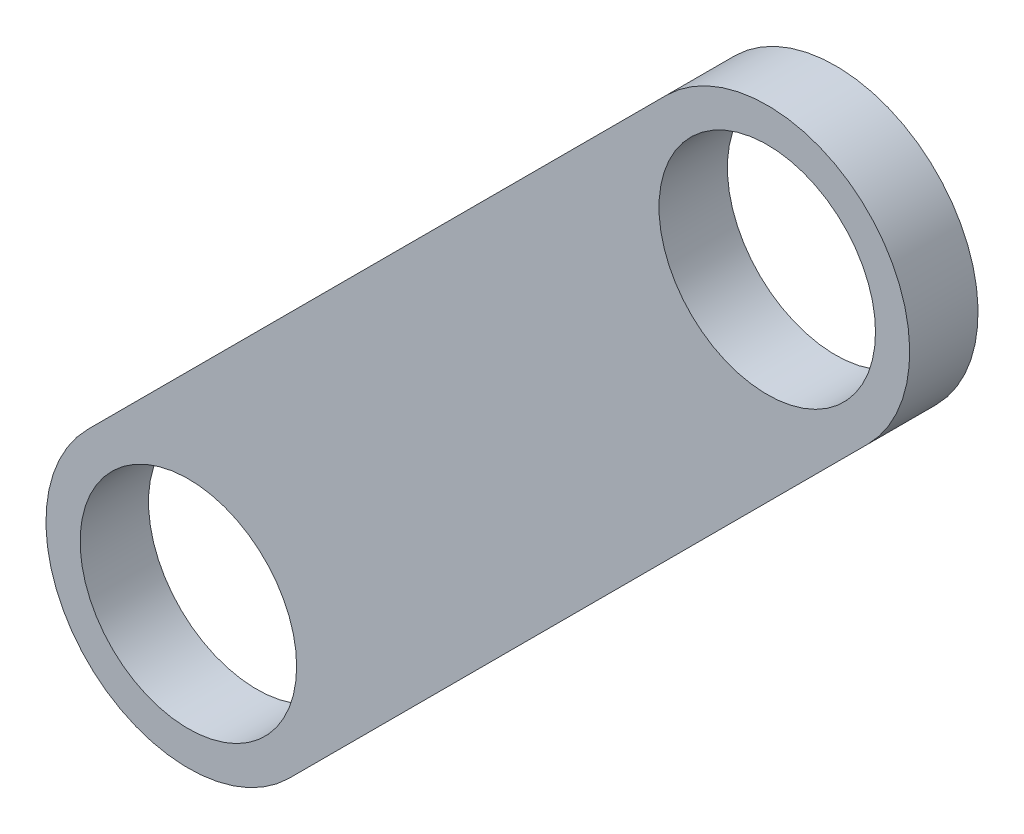
ISO-10303-21;
HEADER;
FILE_DESCRIPTION(('STEP AP214'),'2;1');
FILE_NAME('part.step','',(''),(''),'','','');
FILE_SCHEMA(('AUTOMOTIVE_DESIGN { 1 0 10303 214 1 1 1 1 }'));
ENDSEC;
DATA;
#1=APPLICATION_CONTEXT('core data for automotive mechanical design processes');
#2=APPLICATION_PROTOCOL_DEFINITION('international standard','automotive_design',2000,#1);
#3=PRODUCT_CONTEXT('',#1,'mechanical');
#4=PRODUCT('Part','Part','',(#3));
#5=PRODUCT_RELATED_PRODUCT_CATEGORY('part','',(#4));
#6=PRODUCT_DEFINITION_FORMATION('','',#4);
#7=PRODUCT_DEFINITION_CONTEXT('part definition',#1,'design');
#8=PRODUCT_DEFINITION('design','',#6,#7);
#9=PRODUCT_DEFINITION_SHAPE('','',#8);
#10=(LENGTH_UNIT() NAMED_UNIT(*) SI_UNIT(.MILLI.,.METRE.));
#11=(NAMED_UNIT(*) PLANE_ANGLE_UNIT() SI_UNIT($,.RADIAN.));
#12=(NAMED_UNIT(*) SI_UNIT($,.STERADIAN.) SOLID_ANGLE_UNIT());
#13=UNCERTAINTY_MEASURE_WITH_UNIT(LENGTH_MEASURE(1.E-05),#10,'distance_accuracy_value','');
#14=(GEOMETRIC_REPRESENTATION_CONTEXT(3) GLOBAL_UNCERTAINTY_ASSIGNED_CONTEXT((#13)) GLOBAL_UNIT_ASSIGNED_CONTEXT((#10,
#11,#12)) REPRESENTATION_CONTEXT('',''));
#15=CARTESIAN_POINT('',(0.,0.,0.));
#16=DIRECTION('',(0.,0.,1.));
#17=DIRECTION('',(1.,0.,0.));
#18=AXIS2_PLACEMENT_3D('',#15,#16,#17);
#19=CARTESIAN_POINT('',(0.,0.,6.));
#20=DIRECTION('',(0.,0.,1.));
#21=DIRECTION('',(1.,0.,0.));
#22=AXIS2_PLACEMENT_3D('',#19,#20,#21);
#23=PLANE('',#22);
#24=CARTESIAN_POINT('',(0.,0.,6.));
#25=DIRECTION('',(0.,0.,1.));
#26=DIRECTION('',(1.,0.,0.));
#27=AXIS2_PLACEMENT_3D('',#24,#25,#26);
#28=CIRCLE('',#27,9.5);
#29=CARTESIAN_POINT('',(9.5,0.,6.));
#30=VERTEX_POINT('',#29);
#31=EDGE_CURVE('E103',#30,#30,#28,.T.);
#32=ORIENTED_EDGE('',*,*,#31,.F.);
#33=EDGE_LOOP('',(#32));
#34=FACE_BOUND('',#33,.T.);
#35=CARTESIAN_POINT('',(0.,0.,6.));
#36=DIRECTION('',(0.,0.,1.));
#37=DIRECTION('',(1.,0.,0.));
#38=AXIS2_PLACEMENT_3D('',#35,#36,#37);
#39=CIRCLE('',#38,12.5);
#40=CARTESIAN_POINT('',(-8.83883476483184,8.83883476483184,6.));
#41=VERTEX_POINT('',#40);
#42=CARTESIAN_POINT('',(8.83883476483184,-8.83883476483184,6.));
#43=VERTEX_POINT('',#42);
#44=EDGE_CURVE('E88',#41,#43,#39,.T.);
#45=ORIENTED_EDGE('',*,*,#44,.T.);
#46=DIRECTION('',(0.707106781186548,0.707106781186547,0.));
#47=VECTOR('',#46,1.);
#48=CARTESIAN_POINT('',(8.83883476483184,-8.83883476483184,6.));
#49=LINE('',#48,#47);
#50=CARTESIAN_POINT('',(59.6388347648318,41.9611652351682,6.));
#51=VERTEX_POINT('',#50);
#52=EDGE_CURVE('E83',#43,#51,#49,.T.);
#53=ORIENTED_EDGE('',*,*,#52,.T.);
#54=CARTESIAN_POINT('',(50.8,50.8,6.));
#55=DIRECTION('',(0.,0.,1.));
#56=DIRECTION('',(1.,0.,0.));
#57=AXIS2_PLACEMENT_3D('',#54,#55,#56);
#58=CIRCLE('',#57,12.5);
#59=CARTESIAN_POINT('',(41.9611652351682,59.6388347648318,6.));
#60=VERTEX_POINT('',#59);
#61=EDGE_CURVE('E86',#51,#60,#58,.T.);
#62=ORIENTED_EDGE('',*,*,#61,.T.);
#63=DIRECTION('',(-0.707106781186547,-0.707106781186547,0.));
#64=VECTOR('',#63,1.);
#65=CARTESIAN_POINT('',(-8.83883476483184,8.83883476483184,6.));
#66=LINE('',#65,#64);
#67=EDGE_CURVE('E53',#60,#41,#66,.T.);
#68=ORIENTED_EDGE('',*,*,#67,.T.);
#69=EDGE_LOOP('',(#45,#53,#62,#68));
#70=FACE_BOUND('',#69,.T.);
#71=CARTESIAN_POINT('',(50.8,50.8,6.));
#72=DIRECTION('',(0.,0.,1.));
#73=DIRECTION('',(1.,0.,0.));
#74=AXIS2_PLACEMENT_3D('',#71,#72,#73);
#75=CIRCLE('',#74,9.5);
#76=CARTESIAN_POINT('',(60.3,50.8,6.));
#77=VERTEX_POINT('',#76);
#78=EDGE_CURVE('E118',#77,#77,#75,.T.);
#79=ORIENTED_EDGE('',*,*,#78,.F.);
#80=EDGE_LOOP('',(#79));
#81=FACE_BOUND('',#80,.T.);
#82=ADVANCED_FACE('F36',(#34,#70,#81),#23,.T.);
#83=CARTESIAN_POINT('',(0.,0.,0.));
#84=DIRECTION('',(0.,0.,1.));
#85=DIRECTION('',(1.,0.,0.));
#86=AXIS2_PLACEMENT_3D('',#83,#84,#85);
#87=PLANE('',#86);
#88=CARTESIAN_POINT('',(0.,0.,0.));
#89=DIRECTION('',(0.,0.,1.));
#90=DIRECTION('',(1.,0.,0.));
#91=AXIS2_PLACEMENT_3D('',#88,#89,#90);
#92=CIRCLE('',#91,12.5);
#93=CARTESIAN_POINT('',(-8.83883476483184,8.83883476483184,0.));
#94=VERTEX_POINT('',#93);
#95=CARTESIAN_POINT('',(8.83883476483184,-8.83883476483184,0.));
#96=VERTEX_POINT('',#95);
#97=EDGE_CURVE('E100',#94,#96,#92,.T.);
#98=ORIENTED_EDGE('',*,*,#97,.F.);
#99=DIRECTION('',(-0.707106781186547,-0.707106781186547,0.));
#100=VECTOR('',#99,1.);
#101=CARTESIAN_POINT('',(-8.83883476483184,8.83883476483184,0.));
#102=LINE('',#101,#100);
#103=CARTESIAN_POINT('',(41.9611652351682,59.6388347648318,0.));
#104=VERTEX_POINT('',#103);
#105=EDGE_CURVE('E76',#104,#94,#102,.T.);
#106=ORIENTED_EDGE('',*,*,#105,.F.);
#107=CARTESIAN_POINT('',(50.8,50.8,0.));
#108=DIRECTION('',(0.,0.,1.));
#109=DIRECTION('',(1.,0.,0.));
#110=AXIS2_PLACEMENT_3D('',#107,#108,#109);
#111=CIRCLE('',#110,12.5);
#112=CARTESIAN_POINT('',(59.6388347648318,41.9611652351682,0.));
#113=VERTEX_POINT('',#112);
#114=EDGE_CURVE('E70',#113,#104,#111,.T.);
#115=ORIENTED_EDGE('',*,*,#114,.F.);
#116=DIRECTION('',(0.707106781186548,0.707106781186547,0.));
#117=VECTOR('',#116,1.);
#118=CARTESIAN_POINT('',(8.83883476483184,-8.83883476483184,0.));
#119=LINE('',#118,#117);
#120=EDGE_CURVE('E92',#96,#113,#119,.T.);
#121=ORIENTED_EDGE('',*,*,#120,.F.);
#122=EDGE_LOOP('',(#98,#106,#115,#121));
#123=FACE_BOUND('',#122,.T.);
#124=CARTESIAN_POINT('',(0.,0.,0.));
#125=DIRECTION('',(0.,0.,1.));
#126=DIRECTION('',(1.,0.,0.));
#127=AXIS2_PLACEMENT_3D('',#124,#125,#126);
#128=CIRCLE('',#127,9.5);
#129=CARTESIAN_POINT('',(9.5,0.,0.));
#130=VERTEX_POINT('',#129);
#131=EDGE_CURVE('E115',#130,#130,#128,.T.);
#132=ORIENTED_EDGE('',*,*,#131,.T.);
#133=EDGE_LOOP('',(#132));
#134=FACE_BOUND('',#133,.T.);
#135=CARTESIAN_POINT('',(50.8,50.8,0.));
#136=DIRECTION('',(0.,0.,1.));
#137=DIRECTION('',(1.,0.,0.));
#138=AXIS2_PLACEMENT_3D('',#135,#136,#137);
#139=CIRCLE('',#138,9.5);
#140=CARTESIAN_POINT('',(60.3,50.8,0.));
#141=VERTEX_POINT('',#140);
#142=EDGE_CURVE('E121',#141,#141,#139,.T.);
#143=ORIENTED_EDGE('',*,*,#142,.T.);
#144=EDGE_LOOP('',(#143));
#145=FACE_BOUND('',#144,.T.);
#146=ADVANCED_FACE('F111',(#123,#134,#145),#87,.F.);
#147=CARTESIAN_POINT('',(0.,0.,6.));
#148=DIRECTION('',(0.,0.,-1.));
#149=DIRECTION('',(-1.,0.,0.));
#150=AXIS2_PLACEMENT_3D('',#147,#148,#149);
#151=CYLINDRICAL_SURFACE('',#150,12.5);
#152=ORIENTED_EDGE('',*,*,#97,.T.);
#153=DIRECTION('',(0.,0.,-1.));
#154=VECTOR('',#153,1.);
#155=CARTESIAN_POINT('',(8.83883476483184,-8.83883476483184,6.));
#156=LINE('',#155,#154);
#157=EDGE_CURVE('E11',#43,#96,#156,.T.);
#158=ORIENTED_EDGE('',*,*,#157,.F.);
#159=ORIENTED_EDGE('',*,*,#44,.F.);
#160=DIRECTION('',(0.,0.,-1.));
#161=VECTOR('',#160,1.);
#162=CARTESIAN_POINT('',(-8.83883476483184,8.83883476483184,6.));
#163=LINE('',#162,#161);
#164=EDGE_CURVE('E96',#41,#94,#163,.T.);
#165=ORIENTED_EDGE('',*,*,#164,.T.);
#166=EDGE_LOOP('',(#152,#158,#159,#165));
#167=FACE_BOUND('',#166,.T.);
#168=ADVANCED_FACE('F38',(#167),#151,.T.);
#169=CARTESIAN_POINT('',(8.83883476483184,-8.83883476483184,6.));
#170=DIRECTION('',(-0.707106781186547,0.707106781186548,0.));
#171=DIRECTION('',(-0.707106781186548,-0.707106781186547,0.));
#172=AXIS2_PLACEMENT_3D('',#169,#170,#171);
#173=PLANE('',#172);
#174=ORIENTED_EDGE('',*,*,#120,.T.);
#175=DIRECTION('',(0.,0.,-1.));
#176=VECTOR('',#175,1.);
#177=CARTESIAN_POINT('',(59.6388347648318,41.9611652351682,6.));
#178=LINE('',#177,#176);
#179=EDGE_CURVE('E45',#51,#113,#178,.T.);
#180=ORIENTED_EDGE('',*,*,#179,.F.);
#181=ORIENTED_EDGE('',*,*,#52,.F.);
#182=ORIENTED_EDGE('',*,*,#157,.T.);
#183=EDGE_LOOP('',(#174,#180,#181,#182));
#184=FACE_BOUND('',#183,.T.);
#185=ADVANCED_FACE('F91',(#184),#173,.F.);
#186=CARTESIAN_POINT('',(50.8,50.8,6.));
#187=DIRECTION('',(0.,0.,-1.));
#188=DIRECTION('',(-1.,0.,0.));
#189=AXIS2_PLACEMENT_3D('',#186,#187,#188);
#190=CYLINDRICAL_SURFACE('',#189,12.5);
#191=ORIENTED_EDGE('',*,*,#114,.T.);
#192=DIRECTION('',(0.,0.,-1.));
#193=VECTOR('',#192,1.);
#194=CARTESIAN_POINT('',(41.9611652351682,59.6388347648318,6.));
#195=LINE('',#194,#193);
#196=EDGE_CURVE('E93',#60,#104,#195,.T.);
#197=ORIENTED_EDGE('',*,*,#196,.F.);
#198=ORIENTED_EDGE('',*,*,#61,.F.);
#199=ORIENTED_EDGE('',*,*,#179,.T.);
#200=EDGE_LOOP('',(#191,#197,#198,#199));
#201=FACE_BOUND('',#200,.T.);
#202=ADVANCED_FACE('F94',(#201),#190,.T.);
#203=CARTESIAN_POINT('',(-8.83883476483184,8.83883476483184,6.));
#204=DIRECTION('',(0.707106781186548,-0.707106781186548,0.));
#205=DIRECTION('',(0.707106781186548,0.707106781186548,0.));
#206=AXIS2_PLACEMENT_3D('',#203,#204,#205);
#207=PLANE('',#206);
#208=ORIENTED_EDGE('',*,*,#105,.T.);
#209=ORIENTED_EDGE('',*,*,#164,.F.);
#210=ORIENTED_EDGE('',*,*,#67,.F.);
#211=ORIENTED_EDGE('',*,*,#196,.T.);
#212=EDGE_LOOP('',(#208,#209,#210,#211));
#213=FACE_BOUND('',#212,.T.);
#214=ADVANCED_FACE('F108',(#213),#207,.F.);
#215=CARTESIAN_POINT('',(0.,0.,6.));
#216=DIRECTION('',(0.,0.,-1.));
#217=DIRECTION('',(-1.,0.,0.));
#218=AXIS2_PLACEMENT_3D('',#215,#216,#217);
#219=CYLINDRICAL_SURFACE('',#218,9.5);
#220=ORIENTED_EDGE('',*,*,#31,.T.);
#221=EDGE_LOOP('',(#220));
#222=FACE_BOUND('',#221,.T.);
#223=ORIENTED_EDGE('',*,*,#131,.F.);
#224=EDGE_LOOP('',(#223));
#225=FACE_BOUND('',#224,.T.);
#226=ADVANCED_FACE('F138',(#222,#225),#219,.F.);
#227=CARTESIAN_POINT('',(50.8,50.8,6.));
#228=DIRECTION('',(0.,0.,-1.));
#229=DIRECTION('',(-1.,0.,0.));
#230=AXIS2_PLACEMENT_3D('',#227,#228,#229);
#231=CYLINDRICAL_SURFACE('',#230,9.5);
#232=ORIENTED_EDGE('',*,*,#78,.T.);
#233=EDGE_LOOP('',(#232));
#234=FACE_BOUND('',#233,.T.);
#235=ORIENTED_EDGE('',*,*,#142,.F.);
#236=EDGE_LOOP('',(#235));
#237=FACE_BOUND('',#236,.T.);
#238=ADVANCED_FACE('F127',(#234,#237),#231,.F.);
#239=CLOSED_SHELL('',(#82,#146,#168,#185,#202,#214,#226,#238));
#240=MANIFOLD_SOLID_BREP('B2',#239);
#241=ADVANCED_BREP_SHAPE_REPRESENTATION('',(#18,#240),#14);
#242=SHAPE_DEFINITION_REPRESENTATION(#9,#241);
ENDSEC;
END-ISO-10303-21;
